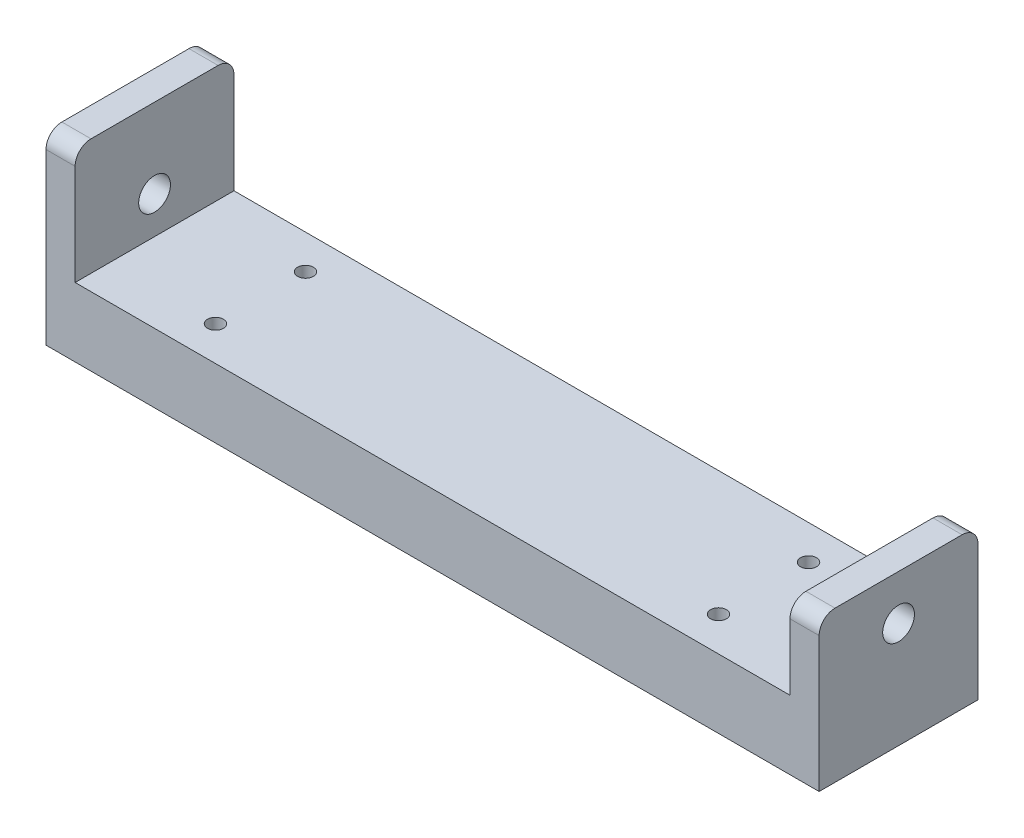
ISO-10303-21;
HEADER;
FILE_DESCRIPTION(('STEP AP214'),'2;1');
FILE_NAME('part.step','',(''),(''),'','','');
FILE_SCHEMA(('AUTOMOTIVE_DESIGN { 1 0 10303 214 1 1 1 1 }'));
ENDSEC;
DATA;
#1=APPLICATION_CONTEXT('core data for automotive mechanical design processes');
#2=APPLICATION_PROTOCOL_DEFINITION('international standard','automotive_design',2000,#1);
#3=PRODUCT_CONTEXT('',#1,'mechanical');
#4=PRODUCT('Part','Part','',(#3));
#5=PRODUCT_RELATED_PRODUCT_CATEGORY('part','',(#4));
#6=PRODUCT_DEFINITION_FORMATION('','',#4);
#7=PRODUCT_DEFINITION_CONTEXT('part definition',#1,'design');
#8=PRODUCT_DEFINITION('design','',#6,#7);
#9=PRODUCT_DEFINITION_SHAPE('','',#8);
#10=(LENGTH_UNIT() NAMED_UNIT(*) SI_UNIT(.MILLI.,.METRE.));
#11=(NAMED_UNIT(*) PLANE_ANGLE_UNIT() SI_UNIT($,.RADIAN.));
#12=(NAMED_UNIT(*) SI_UNIT($,.STERADIAN.) SOLID_ANGLE_UNIT());
#13=UNCERTAINTY_MEASURE_WITH_UNIT(LENGTH_MEASURE(1.E-05),#10,'distance_accuracy_value','');
#14=(GEOMETRIC_REPRESENTATION_CONTEXT(3) GLOBAL_UNCERTAINTY_ASSIGNED_CONTEXT((#13)) GLOBAL_UNIT_ASSIGNED_CONTEXT((#10,
#11,#12)) REPRESENTATION_CONTEXT('',''));
#15=CARTESIAN_POINT('',(0.,0.,0.));
#16=DIRECTION('',(0.,0.,1.));
#17=DIRECTION('',(1.,0.,0.));
#18=AXIS2_PLACEMENT_3D('',#15,#16,#17);
#19=CARTESIAN_POINT('',(0.,35.,15.));
#20=DIRECTION('',(1.,0.,0.));
#21=DIRECTION('',(0.,1.,0.));
#22=AXIS2_PLACEMENT_3D('',#19,#20,#21);
#23=PLANE('',#22);
#24=CARTESIAN_POINT('',(0.,20.,0.));
#25=DIRECTION('',(-1.,0.,0.));
#26=DIRECTION('',(0.,-1.,0.));
#27=AXIS2_PLACEMENT_3D('',#24,#25,#26);
#28=CIRCLE('',#27,3.);
#29=CARTESIAN_POINT('',(0.,17.,0.));
#30=VERTEX_POINT('',#29);
#31=EDGE_CURVE('E278',#30,#30,#28,.T.);
#32=ORIENTED_EDGE('',*,*,#31,.F.);
#33=EDGE_LOOP('',(#32));
#34=FACE_BOUND('',#33,.T.);
#35=DIRECTION('',(0.,0.,-1.));
#36=VECTOR('',#35,1.);
#37=CARTESIAN_POINT('',(0.,35.,15.));
#38=LINE('',#37,#36);
#39=CARTESIAN_POINT('',(0.,35.,12.));
#40=VERTEX_POINT('',#39);
#41=CARTESIAN_POINT('',(0.,35.,-12.));
#42=VERTEX_POINT('',#41);
#43=EDGE_CURVE('E199',#40,#42,#38,.T.);
#44=ORIENTED_EDGE('',*,*,#43,.T.);
#45=CARTESIAN_POINT('',(0.,32.,-12.));
#46=DIRECTION('',(1.,0.,0.));
#47=DIRECTION('',(0.,1.,0.));
#48=AXIS2_PLACEMENT_3D('',#45,#46,#47);
#49=CIRCLE('',#48,3.);
#50=CARTESIAN_POINT('',(0.,32.,-15.));
#51=VERTEX_POINT('',#50);
#52=EDGE_CURVE('E187',#42,#51,#49,.F.);
#53=ORIENTED_EDGE('',*,*,#52,.T.);
#54=DIRECTION('',(0.,-1.,0.));
#55=VECTOR('',#54,1.);
#56=CARTESIAN_POINT('',(0.,35.,-15.));
#57=LINE('',#56,#55);
#58=CARTESIAN_POINT('',(0.,0.,-15.));
#59=VERTEX_POINT('',#58);
#60=EDGE_CURVE('E153',#51,#59,#57,.T.);
#61=ORIENTED_EDGE('',*,*,#60,.T.);
#62=DIRECTION('',(0.,0.,-1.));
#63=VECTOR('',#62,1.);
#64=CARTESIAN_POINT('',(0.,0.,15.));
#65=LINE('',#64,#63);
#66=CARTESIAN_POINT('',(0.,0.,15.));
#67=VERTEX_POINT('',#66);
#68=EDGE_CURVE('E145',#67,#59,#65,.T.);
#69=ORIENTED_EDGE('',*,*,#68,.F.);
#70=DIRECTION('',(0.,-1.,0.));
#71=VECTOR('',#70,1.);
#72=CARTESIAN_POINT('',(0.,35.,15.));
#73=LINE('',#72,#71);
#74=CARTESIAN_POINT('',(0.,32.,15.));
#75=VERTEX_POINT('',#74);
#76=EDGE_CURVE('E129',#75,#67,#73,.T.);
#77=ORIENTED_EDGE('',*,*,#76,.F.);
#78=CARTESIAN_POINT('',(0.,32.,12.));
#79=DIRECTION('',(1.,0.,0.));
#80=DIRECTION('',(0.,1.,0.));
#81=AXIS2_PLACEMENT_3D('',#78,#79,#80);
#82=CIRCLE('',#81,3.);
#83=EDGE_CURVE('E185',#75,#40,#82,.F.);
#84=ORIENTED_EDGE('',*,*,#83,.T.);
#85=EDGE_LOOP('',(#44,#53,#61,#69,#77,#84));
#86=FACE_BOUND('',#85,.T.);
#87=ADVANCED_FACE('F39',(#34,#86),#23,.F.);
#88=CARTESIAN_POINT('',(0.,0.,15.));
#89=DIRECTION('',(0.,1.,0.));
#90=DIRECTION('',(0.,0.,1.));
#91=AXIS2_PLACEMENT_3D('',#88,#89,#90);
#92=PLANE('',#91);
#93=CARTESIAN_POINT('',(120.5,0.,-8.5));
#94=DIRECTION('',(0.,1.,0.));
#95=DIRECTION('',(0.,0.,1.));
#96=AXIS2_PLACEMENT_3D('',#93,#94,#95);
#97=CIRCLE('',#96,1.5);
#98=CARTESIAN_POINT('',(120.5,0.,-7.));
#99=VERTEX_POINT('',#98);
#100=EDGE_CURVE('E257',#99,#99,#97,.F.);
#101=ORIENTED_EDGE('',*,*,#100,.F.);
#102=EDGE_LOOP('',(#101));
#103=FACE_BOUND('',#102,.T.);
#104=CARTESIAN_POINT('',(25.5,0.,8.5));
#105=DIRECTION('',(0.,1.,0.));
#106=DIRECTION('',(0.,0.,1.));
#107=AXIS2_PLACEMENT_3D('',#104,#105,#106);
#108=CIRCLE('',#107,1.5);
#109=CARTESIAN_POINT('',(25.5,0.,10.));
#110=VERTEX_POINT('',#109);
#111=EDGE_CURVE('E258',#110,#110,#108,.F.);
#112=ORIENTED_EDGE('',*,*,#111,.F.);
#113=EDGE_LOOP('',(#112));
#114=FACE_BOUND('',#113,.T.);
#115=CARTESIAN_POINT('',(120.5,0.,8.5));
#116=DIRECTION('',(0.,1.,0.));
#117=DIRECTION('',(0.,0.,1.));
#118=AXIS2_PLACEMENT_3D('',#115,#116,#117);
#119=CIRCLE('',#118,1.5);
#120=CARTESIAN_POINT('',(120.5,0.,10.));
#121=VERTEX_POINT('',#120);
#122=EDGE_CURVE('E265',#121,#121,#119,.F.);
#123=ORIENTED_EDGE('',*,*,#122,.F.);
#124=EDGE_LOOP('',(#123));
#125=FACE_BOUND('',#124,.T.);
#126=CARTESIAN_POINT('',(25.5,0.,-8.5));
#127=DIRECTION('',(0.,1.,0.));
#128=DIRECTION('',(0.,0.,1.));
#129=AXIS2_PLACEMENT_3D('',#126,#127,#128);
#130=CIRCLE('',#129,1.5);
#131=CARTESIAN_POINT('',(25.5,0.,-7.));
#132=VERTEX_POINT('',#131);
#133=EDGE_CURVE('E246',#132,#132,#130,.F.);
#134=ORIENTED_EDGE('',*,*,#133,.F.);
#135=EDGE_LOOP('',(#134));
#136=FACE_BOUND('',#135,.T.);
#137=DIRECTION('',(1.,0.,0.));
#138=VECTOR('',#137,1.);
#139=CARTESIAN_POINT('',(0.,0.,-15.));
#140=LINE('',#139,#138);
#141=CARTESIAN_POINT('',(146.,0.,-15.));
#142=VERTEX_POINT('',#141);
#143=EDGE_CURVE('E242',#59,#142,#140,.T.);
#144=ORIENTED_EDGE('',*,*,#143,.T.);
#145=DIRECTION('',(0.,0.,-1.));
#146=VECTOR('',#145,1.);
#147=CARTESIAN_POINT('',(146.,0.,15.));
#148=LINE('',#147,#146);
#149=CARTESIAN_POINT('',(146.,0.,15.));
#150=VERTEX_POINT('',#149);
#151=EDGE_CURVE('E147',#150,#142,#148,.T.);
#152=ORIENTED_EDGE('',*,*,#151,.F.);
#153=DIRECTION('',(1.,0.,0.));
#154=VECTOR('',#153,1.);
#155=CARTESIAN_POINT('',(0.,0.,15.));
#156=LINE('',#155,#154);
#157=EDGE_CURVE('E133',#67,#150,#156,.T.);
#158=ORIENTED_EDGE('',*,*,#157,.F.);
#159=ORIENTED_EDGE('',*,*,#68,.T.);
#160=EDGE_LOOP('',(#144,#152,#158,#159));
#161=FACE_BOUND('',#160,.T.);
#162=ADVANCED_FACE('F144',(#103,#114,#125,#136,#161),#92,.F.);
#163=CARTESIAN_POINT('',(146.,0.,15.));
#164=DIRECTION('',(-1.,0.,0.));
#165=DIRECTION('',(0.,0.,1.));
#166=AXIS2_PLACEMENT_3D('',#163,#164,#165);
#167=PLANE('',#166);
#168=CARTESIAN_POINT('',(146.,20.,0.));
#169=DIRECTION('',(-1.,0.,0.));
#170=DIRECTION('',(0.,-1.,0.));
#171=AXIS2_PLACEMENT_3D('',#168,#169,#170);
#172=CIRCLE('',#171,3.);
#173=CARTESIAN_POINT('',(146.,17.,0.));
#174=VERTEX_POINT('',#173);
#175=EDGE_CURVE('E281',#174,#174,#172,.T.);
#176=ORIENTED_EDGE('',*,*,#175,.T.);
#177=EDGE_LOOP('',(#176));
#178=FACE_BOUND('',#177,.T.);
#179=DIRECTION('',(0.,1.,0.));
#180=VECTOR('',#179,1.);
#181=CARTESIAN_POINT('',(146.,0.,-15.));
#182=LINE('',#181,#180);
#183=CARTESIAN_POINT('',(146.,25.5,-15.));
#184=VERTEX_POINT('',#183);
#185=EDGE_CURVE('E240',#142,#184,#182,.T.);
#186=ORIENTED_EDGE('',*,*,#185,.T.);
#187=CARTESIAN_POINT('',(146.,25.5,-12.));
#188=DIRECTION('',(-1.,0.,0.));
#189=DIRECTION('',(0.,0.,1.));
#190=AXIS2_PLACEMENT_3D('',#187,#188,#189);
#191=CIRCLE('',#190,3.);
#192=CARTESIAN_POINT('',(146.,28.5,-12.));
#193=VERTEX_POINT('',#192);
#194=EDGE_CURVE('E175',#184,#193,#191,.F.);
#195=ORIENTED_EDGE('',*,*,#194,.T.);
#196=DIRECTION('',(0.,0.,-1.));
#197=VECTOR('',#196,1.);
#198=CARTESIAN_POINT('',(146.,28.5,15.));
#199=LINE('',#198,#197);
#200=CARTESIAN_POINT('',(146.,28.5,12.));
#201=VERTEX_POINT('',#200);
#202=EDGE_CURVE('E159',#201,#193,#199,.T.);
#203=ORIENTED_EDGE('',*,*,#202,.F.);
#204=CARTESIAN_POINT('',(146.,25.5,12.));
#205=DIRECTION('',(-1.,0.,0.));
#206=DIRECTION('',(0.,0.,1.));
#207=AXIS2_PLACEMENT_3D('',#204,#205,#206);
#208=CIRCLE('',#207,3.);
#209=CARTESIAN_POINT('',(146.,25.5,15.));
#210=VERTEX_POINT('',#209);
#211=EDGE_CURVE('E173',#201,#210,#208,.F.);
#212=ORIENTED_EDGE('',*,*,#211,.T.);
#213=DIRECTION('',(0.,1.,0.));
#214=VECTOR('',#213,1.);
#215=CARTESIAN_POINT('',(146.,0.,15.));
#216=LINE('',#215,#214);
#217=EDGE_CURVE('E149',#150,#210,#216,.T.);
#218=ORIENTED_EDGE('',*,*,#217,.F.);
#219=ORIENTED_EDGE('',*,*,#151,.T.);
#220=EDGE_LOOP('',(#186,#195,#203,#212,#218,#219));
#221=FACE_BOUND('',#220,.T.);
#222=ADVANCED_FACE('F307',(#178,#221),#167,.F.);
#223=CARTESIAN_POINT('',(146.,28.5,15.));
#224=DIRECTION('',(0.,-1.,0.));
#225=DIRECTION('',(0.,0.,-1.));
#226=AXIS2_PLACEMENT_3D('',#223,#224,#225);
#227=PLANE('',#226);
#228=ORIENTED_EDGE('',*,*,#202,.T.);
#229=DIRECTION('',(-1.,0.,0.));
#230=VECTOR('',#229,1.);
#231=CARTESIAN_POINT('',(146.,28.5,-12.));
#232=LINE('',#231,#230);
#233=CARTESIAN_POINT('',(140.5,28.5,-12.));
#234=VERTEX_POINT('',#233);
#235=EDGE_CURVE('E157',#193,#234,#232,.T.);
#236=ORIENTED_EDGE('',*,*,#235,.T.);
#237=DIRECTION('',(0.,0.,-1.));
#238=VECTOR('',#237,1.);
#239=CARTESIAN_POINT('',(140.5,28.5,15.));
#240=LINE('',#239,#238);
#241=CARTESIAN_POINT('',(140.5,28.5,12.));
#242=VERTEX_POINT('',#241);
#243=EDGE_CURVE('E213',#242,#234,#240,.T.);
#244=ORIENTED_EDGE('',*,*,#243,.F.);
#245=DIRECTION('',(-1.,0.,0.));
#246=VECTOR('',#245,1.);
#247=CARTESIAN_POINT('',(146.,28.5,12.));
#248=LINE('',#247,#246);
#249=EDGE_CURVE('E155',#242,#201,#248,.F.);
#250=ORIENTED_EDGE('',*,*,#249,.T.);
#251=EDGE_LOOP('',(#228,#236,#244,#250));
#252=FACE_BOUND('',#251,.T.);
#253=ADVANCED_FACE('F219',(#252),#227,.F.);
#254=CARTESIAN_POINT('',(140.5,28.5,15.));
#255=DIRECTION('',(1.,0.,0.));
#256=DIRECTION('',(0.,0.,-1.));
#257=AXIS2_PLACEMENT_3D('',#254,#255,#256);
#258=PLANE('',#257);
#259=CARTESIAN_POINT('',(140.5,20.,0.));
#260=DIRECTION('',(1.,0.,0.));
#261=DIRECTION('',(0.,0.,-1.));
#262=AXIS2_PLACEMENT_3D('',#259,#260,#261);
#263=CIRCLE('',#262,3.);
#264=CARTESIAN_POINT('',(140.5,20.,-3.));
#265=VERTEX_POINT('',#264);
#266=EDGE_CURVE('E275',#265,#265,#263,.T.);
#267=ORIENTED_EDGE('',*,*,#266,.T.);
#268=EDGE_LOOP('',(#267));
#269=FACE_BOUND('',#268,.T.);
#270=ORIENTED_EDGE('',*,*,#243,.T.);
#271=CARTESIAN_POINT('',(140.5,25.5,-12.));
#272=DIRECTION('',(1.,0.,0.));
#273=DIRECTION('',(0.,0.,-1.));
#274=AXIS2_PLACEMENT_3D('',#271,#272,#273);
#275=CIRCLE('',#274,3.);
#276=CARTESIAN_POINT('',(140.5,25.5,-15.));
#277=VERTEX_POINT('',#276);
#278=EDGE_CURVE('E167',#234,#277,#275,.F.);
#279=ORIENTED_EDGE('',*,*,#278,.T.);
#280=DIRECTION('',(0.,-1.,0.));
#281=VECTOR('',#280,1.);
#282=CARTESIAN_POINT('',(140.5,28.5,-15.));
#283=LINE('',#282,#281);
#284=CARTESIAN_POINT('',(140.5,13.,-15.));
#285=VERTEX_POINT('',#284);
#286=EDGE_CURVE('E232',#277,#285,#283,.T.);
#287=ORIENTED_EDGE('',*,*,#286,.T.);
#288=DIRECTION('',(0.,0.,-1.));
#289=VECTOR('',#288,1.);
#290=CARTESIAN_POINT('',(140.5,13.,15.));
#291=LINE('',#290,#289);
#292=CARTESIAN_POINT('',(140.5,13.,15.));
#293=VERTEX_POINT('',#292);
#294=EDGE_CURVE('E210',#293,#285,#291,.T.);
#295=ORIENTED_EDGE('',*,*,#294,.F.);
#296=DIRECTION('',(0.,-1.,0.));
#297=VECTOR('',#296,1.);
#298=CARTESIAN_POINT('',(140.5,28.5,15.));
#299=LINE('',#298,#297);
#300=CARTESIAN_POINT('',(140.5,25.5,15.));
#301=VERTEX_POINT('',#300);
#302=EDGE_CURVE('E249',#301,#293,#299,.T.);
#303=ORIENTED_EDGE('',*,*,#302,.F.);
#304=CARTESIAN_POINT('',(140.5,25.5,12.));
#305=DIRECTION('',(1.,0.,0.));
#306=DIRECTION('',(0.,0.,-1.));
#307=AXIS2_PLACEMENT_3D('',#304,#305,#306);
#308=CIRCLE('',#307,3.);
#309=EDGE_CURVE('E165',#301,#242,#308,.F.);
#310=ORIENTED_EDGE('',*,*,#309,.T.);
#311=EDGE_LOOP('',(#270,#279,#287,#295,#303,#310));
#312=FACE_BOUND('',#311,.T.);
#313=ADVANCED_FACE('F230',(#269,#312),#258,.F.);
#314=CARTESIAN_POINT('',(140.5,13.,15.));
#315=DIRECTION('',(0.,-1.,0.));
#316=DIRECTION('',(1.,0.,0.));
#317=AXIS2_PLACEMENT_3D('',#314,#315,#316);
#318=PLANE('',#317);
#319=CARTESIAN_POINT('',(120.5,13.,-8.5));
#320=DIRECTION('',(0.,1.,0.));
#321=DIRECTION('',(1.,0.,0.));
#322=AXIS2_PLACEMENT_3D('',#319,#320,#321);
#323=CIRCLE('',#322,1.5);
#324=CARTESIAN_POINT('',(122.,13.,-8.5));
#325=VERTEX_POINT('',#324);
#326=EDGE_CURVE('E261',#325,#325,#323,.T.);
#327=ORIENTED_EDGE('',*,*,#326,.F.);
#328=EDGE_LOOP('',(#327));
#329=FACE_BOUND('',#328,.T.);
#330=CARTESIAN_POINT('',(25.5,13.,8.5));
#331=DIRECTION('',(0.,1.,0.));
#332=DIRECTION('',(1.,0.,0.));
#333=AXIS2_PLACEMENT_3D('',#330,#331,#332);
#334=CIRCLE('',#333,1.5);
#335=CARTESIAN_POINT('',(27.,13.,8.5));
#336=VERTEX_POINT('',#335);
#337=EDGE_CURVE('E262',#336,#336,#334,.T.);
#338=ORIENTED_EDGE('',*,*,#337,.F.);
#339=EDGE_LOOP('',(#338));
#340=FACE_BOUND('',#339,.T.);
#341=CARTESIAN_POINT('',(120.5,13.,8.5));
#342=DIRECTION('',(0.,1.,0.));
#343=DIRECTION('',(-1.,0.,0.));
#344=AXIS2_PLACEMENT_3D('',#341,#342,#343);
#345=CIRCLE('',#344,1.5);
#346=CARTESIAN_POINT('',(119.,13.,8.5));
#347=VERTEX_POINT('',#346);
#348=EDGE_CURVE('E272',#347,#347,#345,.T.);
#349=ORIENTED_EDGE('',*,*,#348,.F.);
#350=EDGE_LOOP('',(#349));
#351=FACE_BOUND('',#350,.T.);
#352=CARTESIAN_POINT('',(25.5,13.,-8.5));
#353=DIRECTION('',(0.,1.,0.));
#354=DIRECTION('',(-1.,0.,0.));
#355=AXIS2_PLACEMENT_3D('',#352,#353,#354);
#356=CIRCLE('',#355,1.5);
#357=CARTESIAN_POINT('',(24.,13.,-8.5));
#358=VERTEX_POINT('',#357);
#359=EDGE_CURVE('E254',#358,#358,#356,.T.);
#360=ORIENTED_EDGE('',*,*,#359,.F.);
#361=EDGE_LOOP('',(#360));
#362=FACE_BOUND('',#361,.T.);
#363=DIRECTION('',(-1.,0.,0.));
#364=VECTOR('',#363,1.);
#365=CARTESIAN_POINT('',(140.5,13.,-15.));
#366=LINE('',#365,#364);
#367=CARTESIAN_POINT('',(5.5,13.,-15.));
#368=VERTEX_POINT('',#367);
#369=EDGE_CURVE('E239',#285,#368,#366,.T.);
#370=ORIENTED_EDGE('',*,*,#369,.T.);
#371=DIRECTION('',(0.,0.,-1.));
#372=VECTOR('',#371,1.);
#373=CARTESIAN_POINT('',(5.5,13.,15.));
#374=LINE('',#373,#372);
#375=CARTESIAN_POINT('',(5.5,13.,15.));
#376=VERTEX_POINT('',#375);
#377=EDGE_CURVE('E204',#376,#368,#374,.T.);
#378=ORIENTED_EDGE('',*,*,#377,.F.);
#379=DIRECTION('',(-1.,0.,0.));
#380=VECTOR('',#379,1.);
#381=CARTESIAN_POINT('',(140.5,13.,15.));
#382=LINE('',#381,#380);
#383=EDGE_CURVE('E197',#293,#376,#382,.T.);
#384=ORIENTED_EDGE('',*,*,#383,.F.);
#385=ORIENTED_EDGE('',*,*,#294,.T.);
#386=EDGE_LOOP('',(#370,#378,#384,#385));
#387=FACE_BOUND('',#386,.T.);
#388=ADVANCED_FACE('F327',(#329,#340,#351,#362,#387),#318,.F.);
#389=CARTESIAN_POINT('',(5.5,13.,15.));
#390=DIRECTION('',(-1.,0.,0.));
#391=DIRECTION('',(0.,-1.,0.));
#392=AXIS2_PLACEMENT_3D('',#389,#390,#391);
#393=PLANE('',#392);
#394=CARTESIAN_POINT('',(5.50000000000001,20.,0.));
#395=DIRECTION('',(-1.,0.,0.));
#396=DIRECTION('',(0.,-1.,0.));
#397=AXIS2_PLACEMENT_3D('',#394,#395,#396);
#398=CIRCLE('',#397,3.);
#399=CARTESIAN_POINT('',(5.50000000000001,17.,0.));
#400=VERTEX_POINT('',#399);
#401=EDGE_CURVE('E43',#400,#400,#398,.T.);
#402=ORIENTED_EDGE('',*,*,#401,.T.);
#403=EDGE_LOOP('',(#402));
#404=FACE_BOUND('',#403,.T.);
#405=DIRECTION('',(0.,1.,0.));
#406=VECTOR('',#405,1.);
#407=CARTESIAN_POINT('',(5.5,13.,-15.));
#408=LINE('',#407,#406);
#409=CARTESIAN_POINT('',(5.5,32.,-15.));
#410=VERTEX_POINT('',#409);
#411=EDGE_CURVE('E140',#368,#410,#408,.T.);
#412=ORIENTED_EDGE('',*,*,#411,.T.);
#413=CARTESIAN_POINT('',(5.5,32.,-12.));
#414=DIRECTION('',(-1.,0.,0.));
#415=DIRECTION('',(0.,-1.,0.));
#416=AXIS2_PLACEMENT_3D('',#413,#414,#415);
#417=CIRCLE('',#416,3.);
#418=CARTESIAN_POINT('',(5.5,35.,-12.));
#419=VERTEX_POINT('',#418);
#420=EDGE_CURVE('E11',#410,#419,#417,.F.);
#421=ORIENTED_EDGE('',*,*,#420,.T.);
#422=DIRECTION('',(0.,0.,-1.));
#423=VECTOR('',#422,1.);
#424=CARTESIAN_POINT('',(5.5,35.,15.));
#425=LINE('',#424,#423);
#426=CARTESIAN_POINT('',(5.5,35.,12.));
#427=VERTEX_POINT('',#426);
#428=EDGE_CURVE('E194',#427,#419,#425,.T.);
#429=ORIENTED_EDGE('',*,*,#428,.F.);
#430=CARTESIAN_POINT('',(5.5,32.,12.));
#431=DIRECTION('',(-1.,0.,0.));
#432=DIRECTION('',(0.,-1.,0.));
#433=AXIS2_PLACEMENT_3D('',#430,#431,#432);
#434=CIRCLE('',#433,3.);
#435=CARTESIAN_POINT('',(5.5,32.,15.));
#436=VERTEX_POINT('',#435);
#437=EDGE_CURVE('E48',#427,#436,#434,.F.);
#438=ORIENTED_EDGE('',*,*,#437,.T.);
#439=DIRECTION('',(0.,1.,0.));
#440=VECTOR('',#439,1.);
#441=CARTESIAN_POINT('',(5.5,13.,15.));
#442=LINE('',#441,#440);
#443=EDGE_CURVE('E193',#376,#436,#442,.T.);
#444=ORIENTED_EDGE('',*,*,#443,.F.);
#445=ORIENTED_EDGE('',*,*,#377,.T.);
#446=EDGE_LOOP('',(#412,#421,#429,#438,#444,#445));
#447=FACE_BOUND('',#446,.T.);
#448=ADVANCED_FACE('F191',(#404,#447),#393,.F.);
#449=CARTESIAN_POINT('',(5.5,35.,15.));
#450=DIRECTION('',(0.,-1.,0.));
#451=DIRECTION('',(0.,0.,-1.));
#452=AXIS2_PLACEMENT_3D('',#449,#450,#451);
#453=PLANE('',#452);
#454=ORIENTED_EDGE('',*,*,#428,.T.);
#455=DIRECTION('',(-1.,0.,0.));
#456=VECTOR('',#455,1.);
#457=CARTESIAN_POINT('',(5.5,35.,-12.));
#458=LINE('',#457,#456);
#459=EDGE_CURVE('E182',#419,#42,#458,.T.);
#460=ORIENTED_EDGE('',*,*,#459,.T.);
#461=ORIENTED_EDGE('',*,*,#43,.F.);
#462=DIRECTION('',(-1.,0.,0.));
#463=VECTOR('',#462,1.);
#464=CARTESIAN_POINT('',(5.5,35.,12.));
#465=LINE('',#464,#463);
#466=EDGE_CURVE('E60',#40,#427,#465,.F.);
#467=ORIENTED_EDGE('',*,*,#466,.T.);
#468=EDGE_LOOP('',(#454,#460,#461,#467));
#469=FACE_BOUND('',#468,.T.);
#470=ADVANCED_FACE('F201',(#469),#453,.F.);
#471=CARTESIAN_POINT('',(0.,0.,15.));
#472=DIRECTION('',(0.,0.,1.));
#473=DIRECTION('',(1.,0.,0.));
#474=AXIS2_PLACEMENT_3D('',#471,#472,#473);
#475=PLANE('',#474);
#476=ORIENTED_EDGE('',*,*,#217,.T.);
#477=DIRECTION('',(-1.,0.,0.));
#478=VECTOR('',#477,1.);
#479=CARTESIAN_POINT('',(140.5,25.5,15.));
#480=LINE('',#479,#478);
#481=EDGE_CURVE('E178',#210,#301,#480,.T.);
#482=ORIENTED_EDGE('',*,*,#481,.T.);
#483=ORIENTED_EDGE('',*,*,#302,.T.);
#484=ORIENTED_EDGE('',*,*,#383,.T.);
#485=ORIENTED_EDGE('',*,*,#443,.T.);
#486=DIRECTION('',(-1.,0.,0.));
#487=VECTOR('',#486,1.);
#488=CARTESIAN_POINT('',(0.,32.,15.));
#489=LINE('',#488,#487);
#490=EDGE_CURVE('E137',#436,#75,#489,.T.);
#491=ORIENTED_EDGE('',*,*,#490,.T.);
#492=ORIENTED_EDGE('',*,*,#76,.T.);
#493=ORIENTED_EDGE('',*,*,#157,.T.);
#494=EDGE_LOOP('',(#476,#482,#483,#484,#485,#491,#492,#493));
#495=FACE_BOUND('',#494,.T.);
#496=ADVANCED_FACE('F132',(#495),#475,.T.);
#497=CARTESIAN_POINT('',(0.,0.,-15.));
#498=DIRECTION('',(0.,0.,1.));
#499=DIRECTION('',(1.,0.,0.));
#500=AXIS2_PLACEMENT_3D('',#497,#498,#499);
#501=PLANE('',#500);
#502=ORIENTED_EDGE('',*,*,#286,.F.);
#503=DIRECTION('',(-1.,0.,0.));
#504=VECTOR('',#503,1.);
#505=CARTESIAN_POINT('',(0.,25.5,-15.));
#506=LINE('',#505,#504);
#507=EDGE_CURVE('E171',#277,#184,#506,.F.);
#508=ORIENTED_EDGE('',*,*,#507,.T.);
#509=ORIENTED_EDGE('',*,*,#185,.F.);
#510=ORIENTED_EDGE('',*,*,#143,.F.);
#511=ORIENTED_EDGE('',*,*,#60,.F.);
#512=DIRECTION('',(-1.,0.,0.));
#513=VECTOR('',#512,1.);
#514=CARTESIAN_POINT('',(0.,32.,-15.));
#515=LINE('',#514,#513);
#516=EDGE_CURVE('E169',#51,#410,#515,.F.);
#517=ORIENTED_EDGE('',*,*,#516,.T.);
#518=ORIENTED_EDGE('',*,*,#411,.F.);
#519=ORIENTED_EDGE('',*,*,#369,.F.);
#520=EDGE_LOOP('',(#502,#508,#509,#510,#511,#517,#518,#519));
#521=FACE_BOUND('',#520,.T.);
#522=ADVANCED_FACE('F235',(#521),#501,.F.);
#523=CARTESIAN_POINT('',(25.5,-0.00100000000001314,-8.5));
#524=DIRECTION('',(0.,1.,0.));
#525=DIRECTION('',(-1.,0.,0.));
#526=AXIS2_PLACEMENT_3D('',#523,#524,#525);
#527=CYLINDRICAL_SURFACE('',#526,1.5);
#528=ORIENTED_EDGE('',*,*,#359,.T.);
#529=EDGE_LOOP('',(#528));
#530=FACE_BOUND('',#529,.T.);
#531=ORIENTED_EDGE('',*,*,#133,.T.);
#532=EDGE_LOOP('',(#531));
#533=FACE_BOUND('',#532,.T.);
#534=ADVANCED_FACE('F424',(#530,#533),#527,.F.);
#535=CARTESIAN_POINT('',(120.5,-0.00100000000000273,8.5));
#536=DIRECTION('',(0.,1.,0.));
#537=DIRECTION('',(-1.,0.,0.));
#538=AXIS2_PLACEMENT_3D('',#535,#536,#537);
#539=CYLINDRICAL_SURFACE('',#538,1.5);
#540=ORIENTED_EDGE('',*,*,#348,.T.);
#541=EDGE_LOOP('',(#540));
#542=FACE_BOUND('',#541,.T.);
#543=ORIENTED_EDGE('',*,*,#122,.T.);
#544=EDGE_LOOP('',(#543));
#545=FACE_BOUND('',#544,.T.);
#546=ADVANCED_FACE('F415',(#542,#545),#539,.F.);
#547=CARTESIAN_POINT('',(25.5,-0.00100000000001314,8.5));
#548=DIRECTION('',(0.,1.,0.));
#549=DIRECTION('',(-1.,0.,0.));
#550=AXIS2_PLACEMENT_3D('',#547,#548,#549);
#551=CYLINDRICAL_SURFACE('',#550,1.5);
#552=ORIENTED_EDGE('',*,*,#337,.T.);
#553=EDGE_LOOP('',(#552));
#554=FACE_BOUND('',#553,.T.);
#555=ORIENTED_EDGE('',*,*,#111,.T.);
#556=EDGE_LOOP('',(#555));
#557=FACE_BOUND('',#556,.T.);
#558=ADVANCED_FACE('F406',(#554,#557),#551,.F.);
#559=CARTESIAN_POINT('',(120.5,-0.00100000000000273,-8.5));
#560=DIRECTION('',(0.,1.,0.));
#561=DIRECTION('',(-1.,0.,0.));
#562=AXIS2_PLACEMENT_3D('',#559,#560,#561);
#563=CYLINDRICAL_SURFACE('',#562,1.5);
#564=ORIENTED_EDGE('',*,*,#326,.T.);
#565=EDGE_LOOP('',(#564));
#566=FACE_BOUND('',#565,.T.);
#567=ORIENTED_EDGE('',*,*,#100,.T.);
#568=EDGE_LOOP('',(#567));
#569=FACE_BOUND('',#568,.T.);
#570=ADVANCED_FACE('F316',(#566,#569),#563,.F.);
#571=CARTESIAN_POINT('',(146.,25.5,-12.));
#572=DIRECTION('',(-1.,0.,0.));
#573=DIRECTION('',(0.,0.,1.));
#574=AXIS2_PLACEMENT_3D('',#571,#572,#573);
#575=CYLINDRICAL_SURFACE('',#574,3.);
#576=ORIENTED_EDGE('',*,*,#194,.F.);
#577=ORIENTED_EDGE('',*,*,#507,.F.);
#578=ORIENTED_EDGE('',*,*,#278,.F.);
#579=ORIENTED_EDGE('',*,*,#235,.F.);
#580=EDGE_LOOP('',(#576,#577,#578,#579));
#581=FACE_BOUND('',#580,.T.);
#582=ADVANCED_FACE('F226',(#581),#575,.T.);
#583=CARTESIAN_POINT('',(0.,25.5,12.));
#584=DIRECTION('',(1.,0.,0.));
#585=DIRECTION('',(0.,0.,-1.));
#586=AXIS2_PLACEMENT_3D('',#583,#584,#585);
#587=CYLINDRICAL_SURFACE('',#586,3.);
#588=ORIENTED_EDGE('',*,*,#211,.F.);
#589=ORIENTED_EDGE('',*,*,#249,.F.);
#590=ORIENTED_EDGE('',*,*,#309,.F.);
#591=ORIENTED_EDGE('',*,*,#481,.F.);
#592=EDGE_LOOP('',(#588,#589,#590,#591));
#593=FACE_BOUND('',#592,.T.);
#594=ADVANCED_FACE('F315',(#593),#587,.T.);
#595=CARTESIAN_POINT('',(5.5,32.,-12.));
#596=DIRECTION('',(-1.,0.,0.));
#597=DIRECTION('',(0.,0.,1.));
#598=AXIS2_PLACEMENT_3D('',#595,#596,#597);
#599=CYLINDRICAL_SURFACE('',#598,3.);
#600=ORIENTED_EDGE('',*,*,#420,.F.);
#601=ORIENTED_EDGE('',*,*,#516,.F.);
#602=ORIENTED_EDGE('',*,*,#52,.F.);
#603=ORIENTED_EDGE('',*,*,#459,.F.);
#604=EDGE_LOOP('',(#600,#601,#602,#603));
#605=FACE_BOUND('',#604,.T.);
#606=ADVANCED_FACE('F299',(#605),#599,.T.);
#607=CARTESIAN_POINT('',(0.,32.,12.));
#608=DIRECTION('',(1.,0.,0.));
#609=DIRECTION('',(0.,0.,-1.));
#610=AXIS2_PLACEMENT_3D('',#607,#608,#609);
#611=CYLINDRICAL_SURFACE('',#610,3.);
#612=ORIENTED_EDGE('',*,*,#437,.F.);
#613=ORIENTED_EDGE('',*,*,#466,.F.);
#614=ORIENTED_EDGE('',*,*,#83,.F.);
#615=ORIENTED_EDGE('',*,*,#490,.F.);
#616=EDGE_LOOP('',(#612,#613,#614,#615));
#617=FACE_BOUND('',#616,.T.);
#618=ADVANCED_FACE('F41',(#617),#611,.T.);
#619=CARTESIAN_POINT('',(146.,20.,0.));
#620=DIRECTION('',(-1.,0.,0.));
#621=DIRECTION('',(0.,-1.,0.));
#622=AXIS2_PLACEMENT_3D('',#619,#620,#621);
#623=CYLINDRICAL_SURFACE('',#622,3.);
#624=ORIENTED_EDGE('',*,*,#31,.T.);
#625=EDGE_LOOP('',(#624));
#626=FACE_BOUND('',#625,.T.);
#627=ORIENTED_EDGE('',*,*,#401,.F.);
#628=EDGE_LOOP('',(#627));
#629=FACE_BOUND('',#628,.T.);
#630=ADVANCED_FACE('F289',(#626,#629),#623,.F.);
#631=ORIENTED_EDGE('',*,*,#175,.F.);
#632=EDGE_LOOP('',(#631));
#633=FACE_BOUND('',#632,.T.);
#634=ORIENTED_EDGE('',*,*,#266,.F.);
#635=EDGE_LOOP('',(#634));
#636=FACE_BOUND('',#635,.T.);
#637=ADVANCED_FACE('F291',(#633,#636),#623,.F.);
#638=CLOSED_SHELL('',(#87,#162,#222,#253,#313,#388,#448,#470,#496,#522,#534,#546,#558,#570,#582,
#594,#606,#618,#630,#637));
#639=MANIFOLD_SOLID_BREP('B2',#638);
#640=ADVANCED_BREP_SHAPE_REPRESENTATION('',(#18,#639),#14);
#641=SHAPE_DEFINITION_REPRESENTATION(#9,#640);
ENDSEC;
END-ISO-10303-21;
